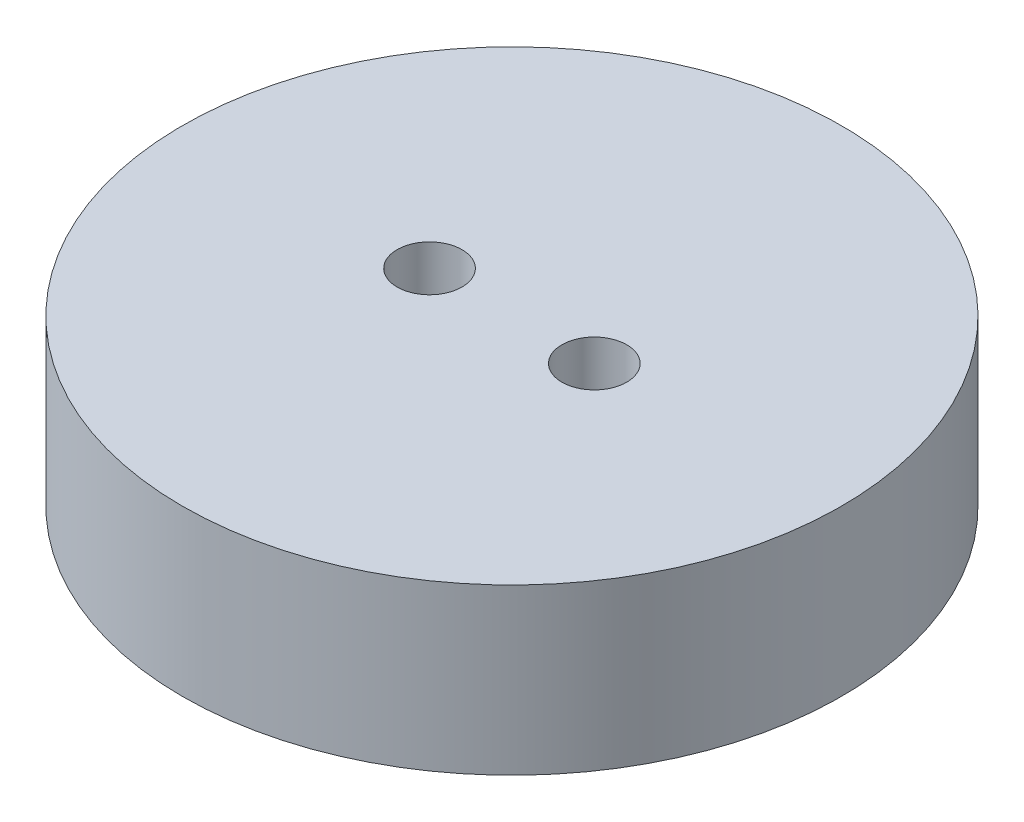
ISO-10303-21;
HEADER;
FILE_DESCRIPTION(('STEP AP214'),'2;1');
FILE_NAME('part.step','',(''),(''),'','','');
FILE_SCHEMA(('AUTOMOTIVE_DESIGN { 1 0 10303 214 1 1 1 1 }'));
ENDSEC;
DATA;
#1=APPLICATION_CONTEXT('core data for automotive mechanical design processes');
#2=APPLICATION_PROTOCOL_DEFINITION('international standard','automotive_design',2000,#1);
#3=PRODUCT_CONTEXT('',#1,'mechanical');
#4=PRODUCT('Part','Part','',(#3));
#5=PRODUCT_RELATED_PRODUCT_CATEGORY('part','',(#4));
#6=PRODUCT_DEFINITION_FORMATION('','',#4);
#7=PRODUCT_DEFINITION_CONTEXT('part definition',#1,'design');
#8=PRODUCT_DEFINITION('design','',#6,#7);
#9=PRODUCT_DEFINITION_SHAPE('','',#8);
#10=(LENGTH_UNIT() NAMED_UNIT(*) SI_UNIT(.MILLI.,.METRE.));
#11=(NAMED_UNIT(*) PLANE_ANGLE_UNIT() SI_UNIT($,.RADIAN.));
#12=(NAMED_UNIT(*) SI_UNIT($,.STERADIAN.) SOLID_ANGLE_UNIT());
#13=UNCERTAINTY_MEASURE_WITH_UNIT(LENGTH_MEASURE(1.E-05),#10,'distance_accuracy_value','');
#14=(GEOMETRIC_REPRESENTATION_CONTEXT(3) GLOBAL_UNCERTAINTY_ASSIGNED_CONTEXT((#13)) GLOBAL_UNIT_ASSIGNED_CONTEXT((#10,
#11,#12)) REPRESENTATION_CONTEXT('',''));
#15=CARTESIAN_POINT('',(0.,0.,0.));
#16=DIRECTION('',(0.,0.,1.));
#17=DIRECTION('',(1.,0.,0.));
#18=AXIS2_PLACEMENT_3D('',#15,#16,#17);
#19=CARTESIAN_POINT('',(0.,12.7,0.));
#20=DIRECTION('',(0.,-1.,0.));
#21=DIRECTION('',(0.,0.,-1.));
#22=AXIS2_PLACEMENT_3D('',#19,#20,#21);
#23=CYLINDRICAL_SURFACE('',#22,25.4);
#24=CARTESIAN_POINT('',(0.,12.7,0.));
#25=DIRECTION('',(0.,1.,0.));
#26=DIRECTION('',(0.,0.,1.));
#27=AXIS2_PLACEMENT_3D('',#24,#25,#26);
#28=CIRCLE('',#27,25.4);
#29=CARTESIAN_POINT('',(0.,12.7,25.4));
#30=VERTEX_POINT('',#29);
#31=EDGE_CURVE('E10',#30,#30,#28,.T.);
#32=ORIENTED_EDGE('',*,*,#31,.F.);
#33=EDGE_LOOP('',(#32));
#34=FACE_BOUND('',#33,.T.);
#35=CARTESIAN_POINT('',(0.,0.,0.));
#36=DIRECTION('',(0.,1.,0.));
#37=DIRECTION('',(0.,0.,1.));
#38=AXIS2_PLACEMENT_3D('',#35,#36,#37);
#39=CIRCLE('',#38,25.4);
#40=CARTESIAN_POINT('',(0.,0.,25.4));
#41=VERTEX_POINT('',#40);
#42=EDGE_CURVE('E40',#41,#41,#39,.T.);
#43=ORIENTED_EDGE('',*,*,#42,.T.);
#44=EDGE_LOOP('',(#43));
#45=FACE_BOUND('',#44,.T.);
#46=ADVANCED_FACE('F37',(#34,#45),#23,.T.);
#47=CARTESIAN_POINT('',(0.,12.7,0.));
#48=DIRECTION('',(0.,1.,0.));
#49=DIRECTION('',(0.,0.,1.));
#50=AXIS2_PLACEMENT_3D('',#47,#48,#49);
#51=PLANE('',#50);
#52=CARTESIAN_POINT('',(6.35,12.7,0.));
#53=DIRECTION('',(0.,1.,0.));
#54=DIRECTION('',(0.,0.,1.));
#55=AXIS2_PLACEMENT_3D('',#52,#53,#54);
#56=CIRCLE('',#55,2.49999999999999);
#57=CARTESIAN_POINT('',(6.35,12.7,2.49999999999999));
#58=VERTEX_POINT('',#57);
#59=EDGE_CURVE('E57',#58,#58,#56,.T.);
#60=ORIENTED_EDGE('',*,*,#59,.F.);
#61=EDGE_LOOP('',(#60));
#62=FACE_BOUND('',#61,.T.);
#63=CARTESIAN_POINT('',(-6.35,12.7,0.));
#64=DIRECTION('',(0.,1.,0.));
#65=DIRECTION('',(0.,0.,1.));
#66=AXIS2_PLACEMENT_3D('',#63,#64,#65);
#67=CIRCLE('',#66,2.49999999999999);
#68=CARTESIAN_POINT('',(-6.35,12.7,2.49999999999999));
#69=VERTEX_POINT('',#68);
#70=EDGE_CURVE('E51',#69,#69,#67,.T.);
#71=ORIENTED_EDGE('',*,*,#70,.F.);
#72=EDGE_LOOP('',(#71));
#73=FACE_BOUND('',#72,.T.);
#74=ORIENTED_EDGE('',*,*,#31,.T.);
#75=EDGE_LOOP('',(#74));
#76=FACE_BOUND('',#75,.T.);
#77=ADVANCED_FACE('F63',(#62,#73,#76),#51,.T.);
#78=CARTESIAN_POINT('',(0.,0.,0.));
#79=DIRECTION('',(0.,1.,0.));
#80=DIRECTION('',(0.,0.,1.));
#81=AXIS2_PLACEMENT_3D('',#78,#79,#80);
#82=PLANE('',#81);
#83=CARTESIAN_POINT('',(6.35,0.,0.));
#84=DIRECTION('',(0.,1.,0.));
#85=DIRECTION('',(0.,0.,1.));
#86=AXIS2_PLACEMENT_3D('',#83,#84,#85);
#87=CIRCLE('',#86,2.5);
#88=CARTESIAN_POINT('',(6.35,0.,2.5));
#89=VERTEX_POINT('',#88);
#90=EDGE_CURVE('E54',#89,#89,#87,.T.);
#91=ORIENTED_EDGE('',*,*,#90,.T.);
#92=EDGE_LOOP('',(#91));
#93=FACE_BOUND('',#92,.T.);
#94=CARTESIAN_POINT('',(-6.35,0.,0.));
#95=DIRECTION('',(0.,1.,0.));
#96=DIRECTION('',(0.,0.,1.));
#97=AXIS2_PLACEMENT_3D('',#94,#95,#96);
#98=CIRCLE('',#97,2.5);
#99=CARTESIAN_POINT('',(-6.35,0.,2.5));
#100=VERTEX_POINT('',#99);
#101=EDGE_CURVE('E47',#100,#100,#98,.T.);
#102=ORIENTED_EDGE('',*,*,#101,.T.);
#103=EDGE_LOOP('',(#102));
#104=FACE_BOUND('',#103,.T.);
#105=ORIENTED_EDGE('',*,*,#42,.F.);
#106=EDGE_LOOP('',(#105));
#107=FACE_BOUND('',#106,.T.);
#108=ADVANCED_FACE('F66',(#93,#104,#107),#82,.F.);
#109=CARTESIAN_POINT('',(-6.35,12.7,0.));
#110=DIRECTION('',(0.,1.,0.));
#111=DIRECTION('',(0.,0.,1.));
#112=AXIS2_PLACEMENT_3D('',#109,#110,#111);
#113=CYLINDRICAL_SURFACE('',#112,2.49999999999999);
#114=ORIENTED_EDGE('',*,*,#101,.F.);
#115=EDGE_LOOP('',(#114));
#116=FACE_BOUND('',#115,.T.);
#117=ORIENTED_EDGE('',*,*,#70,.T.);
#118=EDGE_LOOP('',(#117));
#119=FACE_BOUND('',#118,.T.);
#120=ADVANCED_FACE('F70',(#116,#119),#113,.F.);
#121=CARTESIAN_POINT('',(6.35,12.7,0.));
#122=DIRECTION('',(0.,1.,0.));
#123=DIRECTION('',(0.,0.,1.));
#124=AXIS2_PLACEMENT_3D('',#121,#122,#123);
#125=CYLINDRICAL_SURFACE('',#124,2.49999999999999);
#126=ORIENTED_EDGE('',*,*,#90,.F.);
#127=EDGE_LOOP('',(#126));
#128=FACE_BOUND('',#127,.T.);
#129=ORIENTED_EDGE('',*,*,#59,.T.);
#130=EDGE_LOOP('',(#129));
#131=FACE_BOUND('',#130,.T.);
#132=ADVANCED_FACE('F61',(#128,#131),#125,.F.);
#133=CLOSED_SHELL('',(#46,#77,#108,#120,#132));
#134=MANIFOLD_SOLID_BREP('B2',#133);
#135=ADVANCED_BREP_SHAPE_REPRESENTATION('',(#18,#134),#14);
#136=SHAPE_DEFINITION_REPRESENTATION(#9,#135);
ENDSEC;
END-ISO-10303-21;
